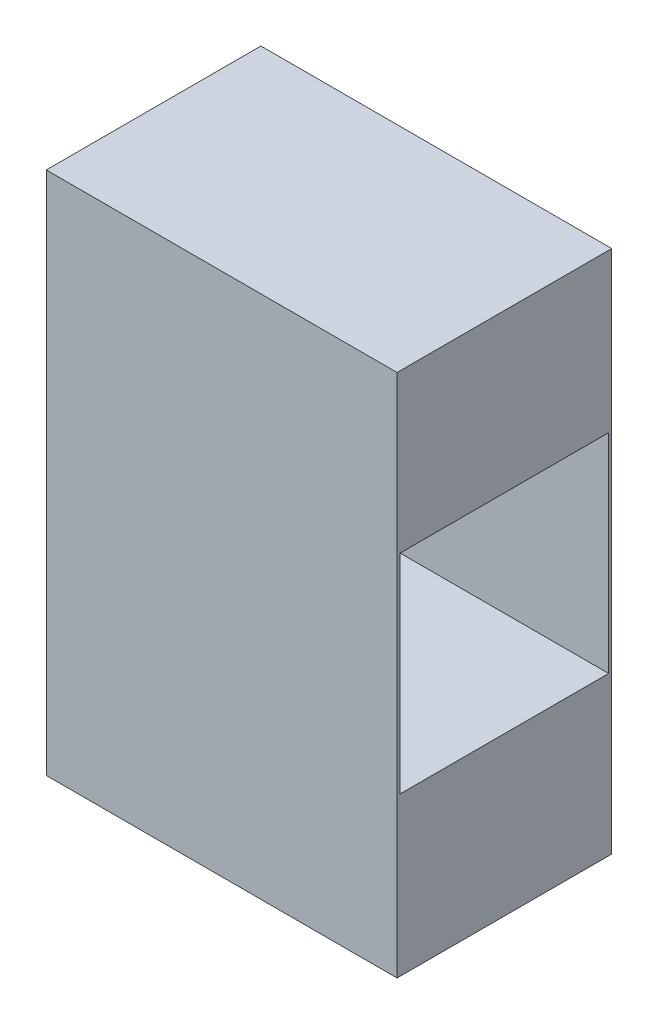
ISO-10303-21;
HEADER;
FILE_DESCRIPTION(('STEP AP214'),'2;1');
FILE_NAME('part.step','',(''),(''),'','','');
FILE_SCHEMA(('AUTOMOTIVE_DESIGN { 1 0 10303 214 1 1 1 1 }'));
ENDSEC;
DATA;
#1=APPLICATION_CONTEXT('core data for automotive mechanical design processes');
#2=APPLICATION_PROTOCOL_DEFINITION('international standard','automotive_design',2000,#1);
#3=PRODUCT_CONTEXT('',#1,'mechanical');
#4=PRODUCT('Part','Part','',(#3));
#5=PRODUCT_RELATED_PRODUCT_CATEGORY('part','',(#4));
#6=PRODUCT_DEFINITION_FORMATION('','',#4);
#7=PRODUCT_DEFINITION_CONTEXT('part definition',#1,'design');
#8=PRODUCT_DEFINITION('design','',#6,#7);
#9=PRODUCT_DEFINITION_SHAPE('','',#8);
#10=(LENGTH_UNIT() NAMED_UNIT(*) SI_UNIT(.MILLI.,.METRE.));
#11=(NAMED_UNIT(*) PLANE_ANGLE_UNIT() SI_UNIT($,.RADIAN.));
#12=(NAMED_UNIT(*) SI_UNIT($,.STERADIAN.) SOLID_ANGLE_UNIT());
#13=UNCERTAINTY_MEASURE_WITH_UNIT(LENGTH_MEASURE(1.E-05),#10,'distance_accuracy_value','');
#14=(GEOMETRIC_REPRESENTATION_CONTEXT(3) GLOBAL_UNCERTAINTY_ASSIGNED_CONTEXT((#13)) GLOBAL_UNIT_ASSIGNED_CONTEXT((#10,
#11,#12)) REPRESENTATION_CONTEXT('',''));
#15=CARTESIAN_POINT('',(0.,0.,0.));
#16=DIRECTION('',(0.,0.,1.));
#17=DIRECTION('',(1.,0.,0.));
#18=AXIS2_PLACEMENT_3D('',#15,#16,#17);
#19=CARTESIAN_POINT('',(0.,43.434,0.));
#20=DIRECTION('',(1.,0.,0.));
#21=DIRECTION('',(0.,0.,-1.));
#22=AXIS2_PLACEMENT_3D('',#19,#20,#21);
#23=PLANE('',#22);
#24=DIRECTION('',(0.,0.,1.));
#25=VECTOR('',#24,1.);
#26=CARTESIAN_POINT('',(0.,0.,0.));
#27=LINE('',#26,#25);
#28=CARTESIAN_POINT('',(0.,0.,-17.78));
#29=VERTEX_POINT('',#28);
#30=CARTESIAN_POINT('',(0.,0.,0.));
#31=VERTEX_POINT('',#30);
#32=EDGE_CURVE('E158',#29,#31,#27,.T.);
#33=ORIENTED_EDGE('',*,*,#32,.T.);
#34=DIRECTION('',(0.,-1.,0.));
#35=VECTOR('',#34,1.);
#36=CARTESIAN_POINT('',(0.,43.434,0.));
#37=LINE('',#36,#35);
#38=CARTESIAN_POINT('',(0.,43.434,0.));
#39=VERTEX_POINT('',#38);
#40=EDGE_CURVE('E11',#39,#31,#37,.T.);
#41=ORIENTED_EDGE('',*,*,#40,.F.);
#42=DIRECTION('',(0.,0.,1.));
#43=VECTOR('',#42,1.);
#44=CARTESIAN_POINT('',(0.,43.434,0.));
#45=LINE('',#44,#43);
#46=CARTESIAN_POINT('',(0.,43.434,-17.78));
#47=VERTEX_POINT('',#46);
#48=EDGE_CURVE('E164',#47,#39,#45,.T.);
#49=ORIENTED_EDGE('',*,*,#48,.F.);
#50=DIRECTION('',(0.,-1.,0.));
#51=VECTOR('',#50,1.);
#52=CARTESIAN_POINT('',(0.,43.434,-17.78));
#53=LINE('',#52,#51);
#54=EDGE_CURVE('E174',#47,#29,#53,.T.);
#55=ORIENTED_EDGE('',*,*,#54,.T.);
#56=EDGE_LOOP('',(#33,#41,#49,#55));
#57=FACE_BOUND('',#56,.T.);
#58=ADVANCED_FACE('F39',(#57),#23,.F.);
#59=CARTESIAN_POINT('',(0.,43.434,0.));
#60=DIRECTION('',(0.,0.,-1.));
#61=DIRECTION('',(-1.,0.,0.));
#62=AXIS2_PLACEMENT_3D('',#59,#60,#61);
#63=PLANE('',#62);
#64=DIRECTION('',(1.,0.,0.));
#65=VECTOR('',#64,1.);
#66=CARTESIAN_POINT('',(0.,0.,0.));
#67=LINE('',#66,#65);
#68=CARTESIAN_POINT('',(29.0576,0.,0.));
#69=VERTEX_POINT('',#68);
#70=EDGE_CURVE('E178',#31,#69,#67,.T.);
#71=ORIENTED_EDGE('',*,*,#70,.T.);
#72=DIRECTION('',(0.,-1.,0.));
#73=VECTOR('',#72,1.);
#74=CARTESIAN_POINT('',(29.0576,43.434,0.));
#75=LINE('',#74,#73);
#76=CARTESIAN_POINT('',(29.0576,43.434,0.));
#77=VERTEX_POINT('',#76);
#78=EDGE_CURVE('E47',#77,#69,#75,.T.);
#79=ORIENTED_EDGE('',*,*,#78,.F.);
#80=DIRECTION('',(1.,0.,0.));
#81=VECTOR('',#80,1.);
#82=CARTESIAN_POINT('',(0.,43.434,0.));
#83=LINE('',#82,#81);
#84=EDGE_CURVE('E91',#39,#77,#83,.T.);
#85=ORIENTED_EDGE('',*,*,#84,.F.);
#86=ORIENTED_EDGE('',*,*,#40,.T.);
#87=EDGE_LOOP('',(#71,#79,#85,#86));
#88=FACE_BOUND('',#87,.T.);
#89=ADVANCED_FACE('F212',(#88),#63,.F.);
#90=CARTESIAN_POINT('',(29.0576,43.434,0.));
#91=DIRECTION('',(-1.,0.,0.));
#92=DIRECTION('',(0.,0.,1.));
#93=AXIS2_PLACEMENT_3D('',#90,#91,#92);
#94=PLANE('',#93);
#95=DIRECTION('',(0.,0.,-1.));
#96=VECTOR('',#95,1.);
#97=CARTESIAN_POINT('',(29.0576,13.081,-17.526));
#98=LINE('',#97,#96);
#99=CARTESIAN_POINT('',(29.0576,13.081,-0.253999999999998));
#100=VERTEX_POINT('',#99);
#101=CARTESIAN_POINT('',(29.0576,13.081,-17.526));
#102=VERTEX_POINT('',#101);
#103=EDGE_CURVE('E149',#100,#102,#98,.T.);
#104=ORIENTED_EDGE('',*,*,#103,.F.);
#105=DIRECTION('',(0.,-1.,0.));
#106=VECTOR('',#105,1.);
#107=CARTESIAN_POINT('',(29.0576,13.081,-0.253999999999998));
#108=LINE('',#107,#106);
#109=CARTESIAN_POINT('',(29.0576,30.353,-0.253999999999998));
#110=VERTEX_POINT('',#109);
#111=EDGE_CURVE('E54',#110,#100,#108,.T.);
#112=ORIENTED_EDGE('',*,*,#111,.F.);
#113=DIRECTION('',(0.,0.,1.));
#114=VECTOR('',#113,1.);
#115=CARTESIAN_POINT('',(29.0576,30.353,-17.526));
#116=LINE('',#115,#114);
#117=CARTESIAN_POINT('',(29.0576,30.353,-17.526));
#118=VERTEX_POINT('',#117);
#119=EDGE_CURVE('E136',#118,#110,#116,.T.);
#120=ORIENTED_EDGE('',*,*,#119,.F.);
#121=DIRECTION('',(0.,1.,0.));
#122=VECTOR('',#121,1.);
#123=CARTESIAN_POINT('',(29.0576,13.081,-17.526));
#124=LINE('',#123,#122);
#125=EDGE_CURVE('E140',#102,#118,#124,.T.);
#126=ORIENTED_EDGE('',*,*,#125,.F.);
#127=EDGE_LOOP('',(#104,#112,#120,#126));
#128=FACE_BOUND('',#127,.T.);
#129=DIRECTION('',(0.,0.,-1.));
#130=VECTOR('',#129,1.);
#131=CARTESIAN_POINT('',(29.0576,0.,0.));
#132=LINE('',#131,#130);
#133=CARTESIAN_POINT('',(29.0576,0.,-17.78));
#134=VERTEX_POINT('',#133);
#135=EDGE_CURVE('E181',#69,#134,#132,.T.);
#136=ORIENTED_EDGE('',*,*,#135,.T.);
#137=DIRECTION('',(0.,-1.,0.));
#138=VECTOR('',#137,1.);
#139=CARTESIAN_POINT('',(29.0576,43.434,-17.78));
#140=LINE('',#139,#138);
#141=CARTESIAN_POINT('',(29.0576,43.434,-17.78));
#142=VERTEX_POINT('',#141);
#143=EDGE_CURVE('E188',#142,#134,#140,.T.);
#144=ORIENTED_EDGE('',*,*,#143,.F.);
#145=DIRECTION('',(0.,0.,-1.));
#146=VECTOR('',#145,1.);
#147=CARTESIAN_POINT('',(29.0576,43.434,0.));
#148=LINE('',#147,#146);
#149=EDGE_CURVE('E169',#77,#142,#148,.T.);
#150=ORIENTED_EDGE('',*,*,#149,.F.);
#151=ORIENTED_EDGE('',*,*,#78,.T.);
#152=EDGE_LOOP('',(#136,#144,#150,#151));
#153=FACE_BOUND('',#152,.T.);
#154=ADVANCED_FACE('F195',(#128,#153),#94,.F.);
#155=CARTESIAN_POINT('',(0.,43.434,-17.78));
#156=DIRECTION('',(0.,0.,1.));
#157=DIRECTION('',(1.,0.,0.));
#158=AXIS2_PLACEMENT_3D('',#155,#156,#157);
#159=PLANE('',#158);
#160=DIRECTION('',(-1.,0.,0.));
#161=VECTOR('',#160,1.);
#162=CARTESIAN_POINT('',(0.,0.,-17.78));
#163=LINE('',#162,#161);
#164=EDGE_CURVE('E84',#134,#29,#163,.T.);
#165=ORIENTED_EDGE('',*,*,#164,.T.);
#166=ORIENTED_EDGE('',*,*,#54,.F.);
#167=DIRECTION('',(-1.,0.,0.));
#168=VECTOR('',#167,1.);
#169=CARTESIAN_POINT('',(0.,43.434,-17.78));
#170=LINE('',#169,#168);
#171=EDGE_CURVE('E63',#142,#47,#170,.T.);
#172=ORIENTED_EDGE('',*,*,#171,.F.);
#173=ORIENTED_EDGE('',*,*,#143,.T.);
#174=EDGE_LOOP('',(#165,#166,#172,#173));
#175=FACE_BOUND('',#174,.T.);
#176=ADVANCED_FACE('F203',(#175),#159,.F.);
#177=CARTESIAN_POINT('',(0.,43.434,0.));
#178=DIRECTION('',(0.,-1.,0.));
#179=DIRECTION('',(0.,0.,-1.));
#180=AXIS2_PLACEMENT_3D('',#177,#178,#179);
#181=PLANE('',#180);
#182=ORIENTED_EDGE('',*,*,#48,.T.);
#183=ORIENTED_EDGE('',*,*,#84,.T.);
#184=ORIENTED_EDGE('',*,*,#149,.T.);
#185=ORIENTED_EDGE('',*,*,#171,.T.);
#186=EDGE_LOOP('',(#182,#183,#184,#185));
#187=FACE_BOUND('',#186,.T.);
#188=ADVANCED_FACE('F205',(#187),#181,.F.);
#189=CARTESIAN_POINT('',(0.,0.,0.));
#190=DIRECTION('',(0.,-1.,0.));
#191=DIRECTION('',(0.,0.,-1.));
#192=AXIS2_PLACEMENT_3D('',#189,#190,#191);
#193=PLANE('',#192);
#194=ORIENTED_EDGE('',*,*,#32,.F.);
#195=ORIENTED_EDGE('',*,*,#164,.F.);
#196=ORIENTED_EDGE('',*,*,#135,.F.);
#197=ORIENTED_EDGE('',*,*,#70,.F.);
#198=EDGE_LOOP('',(#194,#195,#196,#197));
#199=FACE_BOUND('',#198,.T.);
#200=ADVANCED_FACE('F199',(#199),#193,.T.);
#201=CARTESIAN_POINT('',(3.6576,13.081,-0.253999999999998));
#202=DIRECTION('',(0.,0.,1.));
#203=DIRECTION('',(1.,0.,0.));
#204=AXIS2_PLACEMENT_3D('',#201,#202,#203);
#205=PLANE('',#204);
#206=ORIENTED_EDGE('',*,*,#111,.T.);
#207=DIRECTION('',(1.,0.,0.));
#208=VECTOR('',#207,1.);
#209=CARTESIAN_POINT('',(3.6576,13.081,-0.253999999999998));
#210=LINE('',#209,#208);
#211=CARTESIAN_POINT('',(3.6576,13.081,-0.253999999999998));
#212=VERTEX_POINT('',#211);
#213=EDGE_CURVE('E111',#212,#100,#210,.T.);
#214=ORIENTED_EDGE('',*,*,#213,.F.);
#215=DIRECTION('',(0.,-1.,0.));
#216=VECTOR('',#215,1.);
#217=CARTESIAN_POINT('',(3.6576,13.081,-0.253999999999998));
#218=LINE('',#217,#216);
#219=CARTESIAN_POINT('',(3.6576,30.353,-0.253999999999998));
#220=VERTEX_POINT('',#219);
#221=EDGE_CURVE('E115',#220,#212,#218,.T.);
#222=ORIENTED_EDGE('',*,*,#221,.F.);
#223=DIRECTION('',(1.,0.,0.));
#224=VECTOR('',#223,1.);
#225=CARTESIAN_POINT('',(3.6576,30.353,-0.253999999999998));
#226=LINE('',#225,#224);
#227=EDGE_CURVE('E155',#220,#110,#226,.T.);
#228=ORIENTED_EDGE('',*,*,#227,.T.);
#229=EDGE_LOOP('',(#206,#214,#222,#228));
#230=FACE_BOUND('',#229,.T.);
#231=ADVANCED_FACE('F113',(#230),#205,.F.);
#232=CARTESIAN_POINT('',(3.6576,30.353,-17.526));
#233=DIRECTION('',(0.,1.,0.));
#234=DIRECTION('',(0.,0.,1.));
#235=AXIS2_PLACEMENT_3D('',#232,#233,#234);
#236=PLANE('',#235);
#237=ORIENTED_EDGE('',*,*,#119,.T.);
#238=ORIENTED_EDGE('',*,*,#227,.F.);
#239=DIRECTION('',(0.,0.,1.));
#240=VECTOR('',#239,1.);
#241=CARTESIAN_POINT('',(3.6576,30.353,-17.526));
#242=LINE('',#241,#240);
#243=CARTESIAN_POINT('',(3.6576,30.353,-17.526));
#244=VERTEX_POINT('',#243);
#245=EDGE_CURVE('E122',#244,#220,#242,.T.);
#246=ORIENTED_EDGE('',*,*,#245,.F.);
#247=DIRECTION('',(1.,0.,0.));
#248=VECTOR('',#247,1.);
#249=CARTESIAN_POINT('',(3.6576,30.353,-17.526));
#250=LINE('',#249,#248);
#251=EDGE_CURVE('E159',#244,#118,#250,.T.);
#252=ORIENTED_EDGE('',*,*,#251,.T.);
#253=EDGE_LOOP('',(#237,#238,#246,#252));
#254=FACE_BOUND('',#253,.T.);
#255=ADVANCED_FACE('F241',(#254),#236,.F.);
#256=CARTESIAN_POINT('',(3.6576,13.081,-17.526));
#257=DIRECTION('',(0.,0.,-1.));
#258=DIRECTION('',(-1.,0.,0.));
#259=AXIS2_PLACEMENT_3D('',#256,#257,#258);
#260=PLANE('',#259);
#261=ORIENTED_EDGE('',*,*,#125,.T.);
#262=ORIENTED_EDGE('',*,*,#251,.F.);
#263=DIRECTION('',(0.,1.,0.));
#264=VECTOR('',#263,1.);
#265=CARTESIAN_POINT('',(3.6576,13.081,-17.526));
#266=LINE('',#265,#264);
#267=CARTESIAN_POINT('',(3.6576,13.081,-17.526));
#268=VERTEX_POINT('',#267);
#269=EDGE_CURVE('E131',#268,#244,#266,.T.);
#270=ORIENTED_EDGE('',*,*,#269,.F.);
#271=DIRECTION('',(1.,0.,0.));
#272=VECTOR('',#271,1.);
#273=CARTESIAN_POINT('',(3.6576,13.081,-17.526));
#274=LINE('',#273,#272);
#275=EDGE_CURVE('E121',#268,#102,#274,.T.);
#276=ORIENTED_EDGE('',*,*,#275,.T.);
#277=EDGE_LOOP('',(#261,#262,#270,#276));
#278=FACE_BOUND('',#277,.T.);
#279=ADVANCED_FACE('F250',(#278),#260,.F.);
#280=CARTESIAN_POINT('',(3.6576,13.081,-17.526));
#281=DIRECTION('',(0.,-1.,0.));
#282=DIRECTION('',(0.,0.,-1.));
#283=AXIS2_PLACEMENT_3D('',#280,#281,#282);
#284=PLANE('',#283);
#285=ORIENTED_EDGE('',*,*,#103,.T.);
#286=ORIENTED_EDGE('',*,*,#275,.F.);
#287=DIRECTION('',(0.,0.,-1.));
#288=VECTOR('',#287,1.);
#289=CARTESIAN_POINT('',(3.6576,13.081,-17.526));
#290=LINE('',#289,#288);
#291=EDGE_CURVE('E125',#212,#268,#290,.T.);
#292=ORIENTED_EDGE('',*,*,#291,.F.);
#293=ORIENTED_EDGE('',*,*,#213,.T.);
#294=EDGE_LOOP('',(#285,#286,#292,#293));
#295=FACE_BOUND('',#294,.T.);
#296=ADVANCED_FACE('F126',(#295),#284,.F.);
#297=CARTESIAN_POINT('',(3.6576,0.,0.));
#298=DIRECTION('',(1.,0.,0.));
#299=DIRECTION('',(0.,0.,-1.));
#300=AXIS2_PLACEMENT_3D('',#297,#298,#299);
#301=PLANE('',#300);
#302=ORIENTED_EDGE('',*,*,#221,.T.);
#303=ORIENTED_EDGE('',*,*,#291,.T.);
#304=ORIENTED_EDGE('',*,*,#269,.T.);
#305=ORIENTED_EDGE('',*,*,#245,.T.);
#306=EDGE_LOOP('',(#302,#303,#304,#305));
#307=FACE_BOUND('',#306,.T.);
#308=ADVANCED_FACE('F133',(#307),#301,.T.);
#309=CLOSED_SHELL('',(#58,#89,#154,#176,#188,#200,#231,#255,#279,#296,#308));
#310=MANIFOLD_SOLID_BREP('B2',#309);
#311=ADVANCED_BREP_SHAPE_REPRESENTATION('',(#18,#310),#14);
#312=SHAPE_DEFINITION_REPRESENTATION(#9,#311);
ENDSEC;
END-ISO-10303-21;
